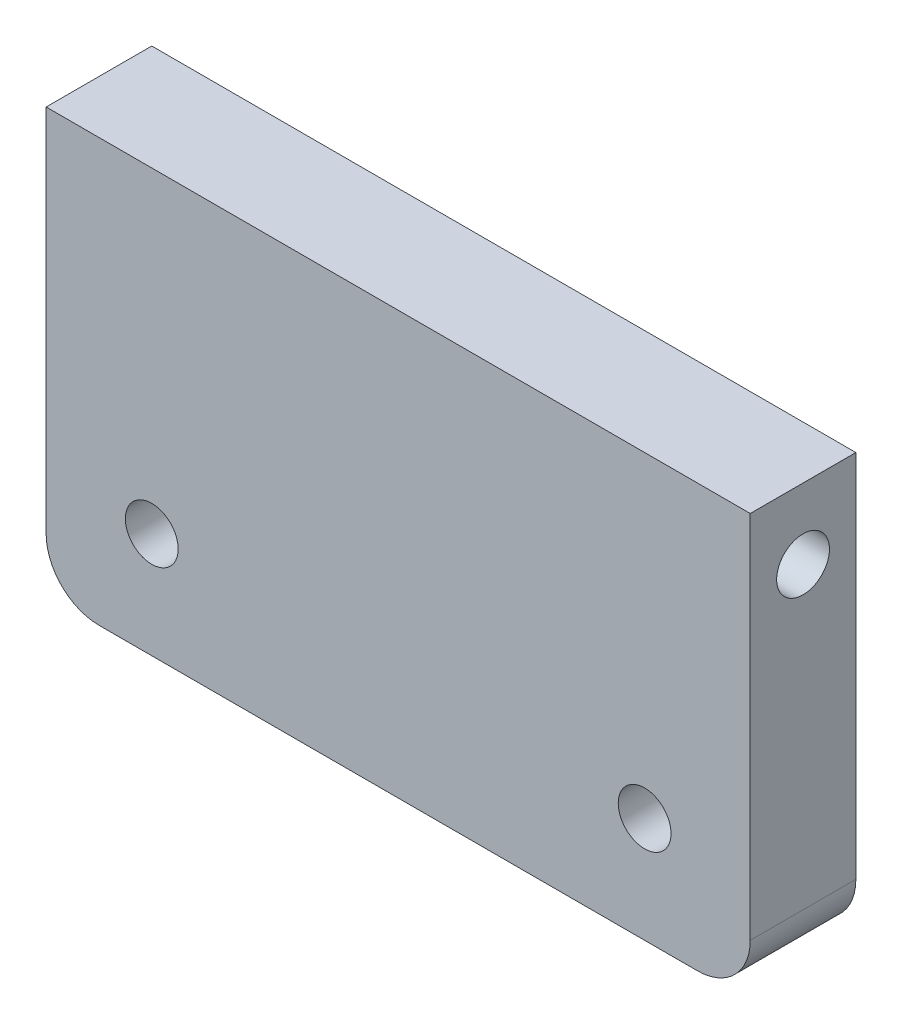
ISO-10303-21;
HEADER;
FILE_DESCRIPTION(('STEP AP214'),'2;1');
FILE_NAME('part.step','',(''),(''),'','','');
FILE_SCHEMA(('AUTOMOTIVE_DESIGN { 1 0 10303 214 1 1 1 1 }'));
ENDSEC;
DATA;
#1=APPLICATION_CONTEXT('core data for automotive mechanical design processes');
#2=APPLICATION_PROTOCOL_DEFINITION('international standard','automotive_design',2000,#1);
#3=PRODUCT_CONTEXT('',#1,'mechanical');
#4=PRODUCT('Part','Part','',(#3));
#5=PRODUCT_RELATED_PRODUCT_CATEGORY('part','',(#4));
#6=PRODUCT_DEFINITION_FORMATION('','',#4);
#7=PRODUCT_DEFINITION_CONTEXT('part definition',#1,'design');
#8=PRODUCT_DEFINITION('design','',#6,#7);
#9=PRODUCT_DEFINITION_SHAPE('','',#8);
#10=(LENGTH_UNIT() NAMED_UNIT(*) SI_UNIT(.MILLI.,.METRE.));
#11=(NAMED_UNIT(*) PLANE_ANGLE_UNIT() SI_UNIT($,.RADIAN.));
#12=(NAMED_UNIT(*) SI_UNIT($,.STERADIAN.) SOLID_ANGLE_UNIT());
#13=UNCERTAINTY_MEASURE_WITH_UNIT(LENGTH_MEASURE(1.E-05),#10,'distance_accuracy_value','');
#14=(GEOMETRIC_REPRESENTATION_CONTEXT(3) GLOBAL_UNCERTAINTY_ASSIGNED_CONTEXT((#13)) GLOBAL_UNIT_ASSIGNED_CONTEXT((#10,
#11,#12)) REPRESENTATION_CONTEXT('',''));
#15=CARTESIAN_POINT('',(0.,0.,0.));
#16=DIRECTION('',(0.,0.,1.));
#17=DIRECTION('',(1.,0.,0.));
#18=AXIS2_PLACEMENT_3D('',#15,#16,#17);
#19=CARTESIAN_POINT('',(-53.975,-28.575,19.05));
#20=DIRECTION('',(0.,0.,1.));
#21=DIRECTION('',(1.,0.,0.));
#22=AXIS2_PLACEMENT_3D('',#19,#20,#21);
#23=PLANE('',#22);
#24=CARTESIAN_POINT('',(-44.45,-19.05,19.05));
#25=DIRECTION('',(0.,0.,1.));
#26=DIRECTION('',(1.,0.,0.));
#27=AXIS2_PLACEMENT_3D('',#24,#25,#26);
#28=CIRCLE('',#27,4.7625);
#29=CARTESIAN_POINT('',(-49.2125,-19.05,19.05));
#30=VERTEX_POINT('',#29);
#31=EDGE_CURVE('E134',#30,#30,#28,.T.);
#32=ORIENTED_EDGE('',*,*,#31,.F.);
#33=EDGE_LOOP('',(#32));
#34=FACE_BOUND('',#33,.T.);
#35=DIRECTION('',(0.,-1.,0.));
#36=VECTOR('',#35,1.);
#37=CARTESIAN_POINT('',(-63.5,38.1,19.05));
#38=LINE('',#37,#36);
#39=CARTESIAN_POINT('',(-63.5,38.1,19.05));
#40=VERTEX_POINT('',#39);
#41=CARTESIAN_POINT('',(-63.5,-28.5749999999999,19.05));
#42=VERTEX_POINT('',#41);
#43=EDGE_CURVE('E146',#40,#42,#38,.T.);
#44=ORIENTED_EDGE('',*,*,#43,.T.);
#45=CARTESIAN_POINT('',(-53.975,-28.575,19.05));
#46=DIRECTION('',(0.,0.,1.));
#47=DIRECTION('',(1.,0.,0.));
#48=AXIS2_PLACEMENT_3D('',#45,#46,#47);
#49=CIRCLE('',#48,9.525);
#50=CARTESIAN_POINT('',(-53.9749999999999,-38.1,19.05));
#51=VERTEX_POINT('',#50);
#52=EDGE_CURVE('E94',#42,#51,#49,.T.);
#53=ORIENTED_EDGE('',*,*,#52,.T.);
#54=DIRECTION('',(1.,0.,0.));
#55=VECTOR('',#54,1.);
#56=CARTESIAN_POINT('',(-53.9749999999999,-38.1,19.05));
#57=LINE('',#56,#55);
#58=CARTESIAN_POINT('',(53.9749999999999,-38.1,19.05));
#59=VERTEX_POINT('',#58);
#60=EDGE_CURVE('E107',#51,#59,#57,.T.);
#61=ORIENTED_EDGE('',*,*,#60,.T.);
#62=CARTESIAN_POINT('',(53.975,-28.575,19.05));
#63=DIRECTION('',(0.,0.,1.));
#64=DIRECTION('',(-1.,0.,0.));
#65=AXIS2_PLACEMENT_3D('',#62,#63,#64);
#66=CIRCLE('',#65,9.525);
#67=CARTESIAN_POINT('',(63.5,-28.5749999999999,19.05));
#68=VERTEX_POINT('',#67);
#69=EDGE_CURVE('E101',#59,#68,#66,.T.);
#70=ORIENTED_EDGE('',*,*,#69,.T.);
#71=DIRECTION('',(0.,1.,0.));
#72=VECTOR('',#71,1.);
#73=CARTESIAN_POINT('',(63.5,38.1,19.05));
#74=LINE('',#73,#72);
#75=CARTESIAN_POINT('',(63.5,38.1,19.05));
#76=VERTEX_POINT('',#75);
#77=EDGE_CURVE('E105',#68,#76,#74,.T.);
#78=ORIENTED_EDGE('',*,*,#77,.T.);
#79=DIRECTION('',(-1.,0.,0.));
#80=VECTOR('',#79,1.);
#81=CARTESIAN_POINT('',(-63.5,38.1,19.05));
#82=LINE('',#81,#80);
#83=EDGE_CURVE('E57',#76,#40,#82,.T.);
#84=ORIENTED_EDGE('',*,*,#83,.T.);
#85=EDGE_LOOP('',(#44,#53,#61,#70,#78,#84));
#86=FACE_BOUND('',#85,.T.);
#87=CARTESIAN_POINT('',(44.45,-19.05,19.05));
#88=DIRECTION('',(0.,0.,1.));
#89=DIRECTION('',(-1.,0.,0.));
#90=AXIS2_PLACEMENT_3D('',#87,#88,#89);
#91=CIRCLE('',#90,4.7625);
#92=CARTESIAN_POINT('',(39.6875,-19.05,19.05));
#93=VERTEX_POINT('',#92);
#94=EDGE_CURVE('E208',#93,#93,#91,.T.);
#95=ORIENTED_EDGE('',*,*,#94,.F.);
#96=EDGE_LOOP('',(#95));
#97=FACE_BOUND('',#96,.T.);
#98=ADVANCED_FACE('F39',(#34,#86,#97),#23,.T.);
#99=CARTESIAN_POINT('',(-53.975,-28.575,0.));
#100=DIRECTION('',(0.,0.,1.));
#101=DIRECTION('',(1.,0.,0.));
#102=AXIS2_PLACEMENT_3D('',#99,#100,#101);
#103=PLANE('',#102);
#104=DIRECTION('',(0.,-1.,0.));
#105=VECTOR('',#104,1.);
#106=CARTESIAN_POINT('',(-63.5,38.1,0.));
#107=LINE('',#106,#105);
#108=CARTESIAN_POINT('',(-63.5,38.1,0.));
#109=VERTEX_POINT('',#108);
#110=CARTESIAN_POINT('',(-63.5,-28.5749999999999,0.));
#111=VERTEX_POINT('',#110);
#112=EDGE_CURVE('E129',#109,#111,#107,.T.);
#113=ORIENTED_EDGE('',*,*,#112,.F.);
#114=DIRECTION('',(-1.,0.,0.));
#115=VECTOR('',#114,1.);
#116=CARTESIAN_POINT('',(-63.5,38.1,0.));
#117=LINE('',#116,#115);
#118=CARTESIAN_POINT('',(63.5,38.1,0.));
#119=VERTEX_POINT('',#118);
#120=EDGE_CURVE('E86',#119,#109,#117,.T.);
#121=ORIENTED_EDGE('',*,*,#120,.F.);
#122=DIRECTION('',(0.,1.,0.));
#123=VECTOR('',#122,1.);
#124=CARTESIAN_POINT('',(63.5,38.1,0.));
#125=LINE('',#124,#123);
#126=CARTESIAN_POINT('',(63.5,-28.5749999999999,0.));
#127=VERTEX_POINT('',#126);
#128=EDGE_CURVE('E80',#127,#119,#125,.T.);
#129=ORIENTED_EDGE('',*,*,#128,.F.);
#130=CARTESIAN_POINT('',(53.975,-28.575,0.));
#131=DIRECTION('',(0.,0.,1.));
#132=DIRECTION('',(-1.,0.,0.));
#133=AXIS2_PLACEMENT_3D('',#130,#131,#132);
#134=CIRCLE('',#133,9.525);
#135=CARTESIAN_POINT('',(53.9749999999999,-38.1,0.));
#136=VERTEX_POINT('',#135);
#137=EDGE_CURVE('E116',#136,#127,#134,.T.);
#138=ORIENTED_EDGE('',*,*,#137,.F.);
#139=DIRECTION('',(1.,0.,0.));
#140=VECTOR('',#139,1.);
#141=CARTESIAN_POINT('',(-53.9749999999999,-38.1,0.));
#142=LINE('',#141,#140);
#143=CARTESIAN_POINT('',(-53.9749999999999,-38.1,0.));
#144=VERTEX_POINT('',#143);
#145=EDGE_CURVE('E137',#144,#136,#142,.T.);
#146=ORIENTED_EDGE('',*,*,#145,.F.);
#147=CARTESIAN_POINT('',(-53.975,-28.575,0.));
#148=DIRECTION('',(0.,0.,1.));
#149=DIRECTION('',(1.,0.,0.));
#150=AXIS2_PLACEMENT_3D('',#147,#148,#149);
#151=CIRCLE('',#150,9.525);
#152=EDGE_CURVE('E133',#111,#144,#151,.T.);
#153=ORIENTED_EDGE('',*,*,#152,.F.);
#154=EDGE_LOOP('',(#113,#121,#129,#138,#146,#153));
#155=FACE_BOUND('',#154,.T.);
#156=CARTESIAN_POINT('',(-44.45,-19.05,0.));
#157=DIRECTION('',(0.,0.,1.));
#158=DIRECTION('',(1.,0.,0.));
#159=AXIS2_PLACEMENT_3D('',#156,#157,#158);
#160=CIRCLE('',#159,4.7625);
#161=CARTESIAN_POINT('',(-49.2125,-19.05,0.));
#162=VERTEX_POINT('',#161);
#163=EDGE_CURVE('E214',#162,#162,#160,.T.);
#164=ORIENTED_EDGE('',*,*,#163,.T.);
#165=EDGE_LOOP('',(#164));
#166=FACE_BOUND('',#165,.T.);
#167=CARTESIAN_POINT('',(44.45,-19.05,0.));
#168=DIRECTION('',(0.,0.,1.));
#169=DIRECTION('',(-1.,0.,0.));
#170=AXIS2_PLACEMENT_3D('',#167,#168,#169);
#171=CIRCLE('',#170,4.7625);
#172=CARTESIAN_POINT('',(39.6875,-19.05,0.));
#173=VERTEX_POINT('',#172);
#174=EDGE_CURVE('E203',#173,#173,#171,.T.);
#175=ORIENTED_EDGE('',*,*,#174,.T.);
#176=EDGE_LOOP('',(#175));
#177=FACE_BOUND('',#176,.T.);
#178=ADVANCED_FACE('F159',(#155,#166,#177),#103,.F.);
#179=CARTESIAN_POINT('',(-63.5,38.1,19.05));
#180=DIRECTION('',(1.,0.,0.));
#181=DIRECTION('',(0.,0.,-1.));
#182=AXIS2_PLACEMENT_3D('',#179,#180,#181);
#183=PLANE('',#182);
#184=CARTESIAN_POINT('',(-63.5,25.4,9.525));
#185=DIRECTION('',(1.,0.,0.));
#186=DIRECTION('',(0.,0.,-1.));
#187=AXIS2_PLACEMENT_3D('',#184,#185,#186);
#188=CIRCLE('',#187,4.7625);
#189=CARTESIAN_POINT('',(-63.5,25.4,4.7625));
#190=VERTEX_POINT('',#189);
#191=EDGE_CURVE('E200',#190,#190,#188,.T.);
#192=ORIENTED_EDGE('',*,*,#191,.T.);
#193=EDGE_LOOP('',(#192));
#194=FACE_BOUND('',#193,.T.);
#195=ORIENTED_EDGE('',*,*,#112,.T.);
#196=DIRECTION('',(0.,0.,-1.));
#197=VECTOR('',#196,1.);
#198=CARTESIAN_POINT('',(-63.5,-28.5749999999999,19.05));
#199=LINE('',#198,#197);
#200=EDGE_CURVE('E11',#42,#111,#199,.T.);
#201=ORIENTED_EDGE('',*,*,#200,.F.);
#202=ORIENTED_EDGE('',*,*,#43,.F.);
#203=DIRECTION('',(0.,0.,-1.));
#204=VECTOR('',#203,1.);
#205=CARTESIAN_POINT('',(-63.5,38.1,19.05));
#206=LINE('',#205,#204);
#207=EDGE_CURVE('E125',#40,#109,#206,.T.);
#208=ORIENTED_EDGE('',*,*,#207,.T.);
#209=EDGE_LOOP('',(#195,#201,#202,#208));
#210=FACE_BOUND('',#209,.T.);
#211=ADVANCED_FACE('F41',(#194,#210),#183,.F.);
#212=CARTESIAN_POINT('',(-53.975,-28.575,19.05));
#213=DIRECTION('',(0.,0.,-1.));
#214=DIRECTION('',(-1.,0.,0.));
#215=AXIS2_PLACEMENT_3D('',#212,#213,#214);
#216=CYLINDRICAL_SURFACE('',#215,9.525);
#217=ORIENTED_EDGE('',*,*,#152,.T.);
#218=DIRECTION('',(0.,0.,-1.));
#219=VECTOR('',#218,1.);
#220=CARTESIAN_POINT('',(-53.9749999999999,-38.1,19.05));
#221=LINE('',#220,#219);
#222=EDGE_CURVE('E49',#51,#144,#221,.T.);
#223=ORIENTED_EDGE('',*,*,#222,.F.);
#224=ORIENTED_EDGE('',*,*,#52,.F.);
#225=ORIENTED_EDGE('',*,*,#200,.T.);
#226=EDGE_LOOP('',(#217,#223,#224,#225));
#227=FACE_BOUND('',#226,.T.);
#228=ADVANCED_FACE('F233',(#227),#216,.T.);
#229=CARTESIAN_POINT('',(-53.9749999999999,-38.1,19.05));
#230=DIRECTION('',(0.,1.,0.));
#231=DIRECTION('',(0.,0.,1.));
#232=AXIS2_PLACEMENT_3D('',#229,#230,#231);
#233=PLANE('',#232);
#234=ORIENTED_EDGE('',*,*,#145,.T.);
#235=DIRECTION('',(0.,0.,-1.));
#236=VECTOR('',#235,1.);
#237=CARTESIAN_POINT('',(53.9749999999999,-38.1,19.05));
#238=LINE('',#237,#236);
#239=EDGE_CURVE('E118',#59,#136,#238,.T.);
#240=ORIENTED_EDGE('',*,*,#239,.F.);
#241=ORIENTED_EDGE('',*,*,#60,.F.);
#242=ORIENTED_EDGE('',*,*,#222,.T.);
#243=EDGE_LOOP('',(#234,#240,#241,#242));
#244=FACE_BOUND('',#243,.T.);
#245=ADVANCED_FACE('F156',(#244),#233,.F.);
#246=CARTESIAN_POINT('',(53.975,-28.575,19.05));
#247=DIRECTION('',(0.,0.,-1.));
#248=DIRECTION('',(-1.,0.,0.));
#249=AXIS2_PLACEMENT_3D('',#246,#247,#248);
#250=CYLINDRICAL_SURFACE('',#249,9.525);
#251=ORIENTED_EDGE('',*,*,#137,.T.);
#252=DIRECTION('',(0.,0.,-1.));
#253=VECTOR('',#252,1.);
#254=CARTESIAN_POINT('',(63.5,-28.5749999999999,19.05));
#255=LINE('',#254,#253);
#256=EDGE_CURVE('E113',#68,#127,#255,.T.);
#257=ORIENTED_EDGE('',*,*,#256,.F.);
#258=ORIENTED_EDGE('',*,*,#69,.F.);
#259=ORIENTED_EDGE('',*,*,#239,.T.);
#260=EDGE_LOOP('',(#251,#257,#258,#259));
#261=FACE_BOUND('',#260,.T.);
#262=ADVANCED_FACE('F114',(#261),#250,.T.);
#263=CARTESIAN_POINT('',(63.5,38.1,19.05));
#264=DIRECTION('',(-1.,0.,0.));
#265=DIRECTION('',(0.,0.,1.));
#266=AXIS2_PLACEMENT_3D('',#263,#264,#265);
#267=PLANE('',#266);
#268=CARTESIAN_POINT('',(63.5,25.4,9.525));
#269=DIRECTION('',(1.,0.,0.));
#270=DIRECTION('',(0.,0.,-1.));
#271=AXIS2_PLACEMENT_3D('',#268,#269,#270);
#272=CIRCLE('',#271,4.7625);
#273=CARTESIAN_POINT('',(63.5,25.4,4.7625));
#274=VERTEX_POINT('',#273);
#275=EDGE_CURVE('E197',#274,#274,#272,.T.);
#276=ORIENTED_EDGE('',*,*,#275,.F.);
#277=EDGE_LOOP('',(#276));
#278=FACE_BOUND('',#277,.T.);
#279=ORIENTED_EDGE('',*,*,#128,.T.);
#280=DIRECTION('',(0.,0.,-1.));
#281=VECTOR('',#280,1.);
#282=CARTESIAN_POINT('',(63.5,38.1,19.05));
#283=LINE('',#282,#281);
#284=EDGE_CURVE('E119',#76,#119,#283,.T.);
#285=ORIENTED_EDGE('',*,*,#284,.F.);
#286=ORIENTED_EDGE('',*,*,#77,.F.);
#287=ORIENTED_EDGE('',*,*,#256,.T.);
#288=EDGE_LOOP('',(#279,#285,#286,#287));
#289=FACE_BOUND('',#288,.T.);
#290=ADVANCED_FACE('F121',(#278,#289),#267,.F.);
#291=CARTESIAN_POINT('',(-63.5,38.1,19.05));
#292=DIRECTION('',(0.,-1.,0.));
#293=DIRECTION('',(0.,0.,-1.));
#294=AXIS2_PLACEMENT_3D('',#291,#292,#293);
#295=PLANE('',#294);
#296=ORIENTED_EDGE('',*,*,#120,.T.);
#297=ORIENTED_EDGE('',*,*,#207,.F.);
#298=ORIENTED_EDGE('',*,*,#83,.F.);
#299=ORIENTED_EDGE('',*,*,#284,.T.);
#300=EDGE_LOOP('',(#296,#297,#298,#299));
#301=FACE_BOUND('',#300,.T.);
#302=ADVANCED_FACE('F164',(#301),#295,.F.);
#303=CARTESIAN_POINT('',(-44.45,-19.05,19.05));
#304=DIRECTION('',(0.,0.,-1.));
#305=DIRECTION('',(-1.,0.,0.));
#306=AXIS2_PLACEMENT_3D('',#303,#304,#305);
#307=CYLINDRICAL_SURFACE('',#306,4.7625);
#308=CARTESIAN_POINT('',(-49.2125,-19.05,19.05));
#309=CARTESIAN_POINT('',(-49.2125,-19.05,18.8515625));
#310=CARTESIAN_POINT('',(-49.2125,-19.05,18.653125));
#311=CARTESIAN_POINT('',(-49.2125,-19.05,18.25625));
#312=CARTESIAN_POINT('',(-49.2125,-19.05,18.0578125));
#313=CARTESIAN_POINT('',(-49.2125,-19.05,17.6609375));
#314=CARTESIAN_POINT('',(-49.2125,-19.05,17.4625));
#315=CARTESIAN_POINT('',(-49.2125,-19.05,17.065625));
#316=CARTESIAN_POINT('',(-49.2125,-19.05,16.8671875));
#317=CARTESIAN_POINT('',(-49.2125,-19.05,16.4703125));
#318=CARTESIAN_POINT('',(-49.2125,-19.05,16.271875));
#319=CARTESIAN_POINT('',(-49.2125,-19.05,15.875));
#320=CARTESIAN_POINT('',(-49.2125,-19.05,15.6765625));
#321=CARTESIAN_POINT('',(-49.2125,-19.05,15.2796875));
#322=CARTESIAN_POINT('',(-49.2125,-19.05,15.08125));
#323=CARTESIAN_POINT('',(-49.2125,-19.05,14.684375));
#324=CARTESIAN_POINT('',(-49.2125,-19.05,14.4859375));
#325=CARTESIAN_POINT('',(-49.2125,-19.05,14.0890625));
#326=CARTESIAN_POINT('',(-49.2125,-19.05,13.890625));
#327=CARTESIAN_POINT('',(-49.2125,-19.05,13.49375));
#328=CARTESIAN_POINT('',(-49.2125,-19.05,13.2953125));
#329=CARTESIAN_POINT('',(-49.2125,-19.05,12.8984375));
#330=CARTESIAN_POINT('',(-49.2125,-19.05,12.7));
#331=CARTESIAN_POINT('',(-49.2125,-19.05,12.303125));
#332=CARTESIAN_POINT('',(-49.2125,-19.05,12.1046875));
#333=CARTESIAN_POINT('',(-49.2125,-19.05,11.7078125));
#334=CARTESIAN_POINT('',(-49.2125,-19.05,11.509375));
#335=CARTESIAN_POINT('',(-49.2125,-19.05,11.1125));
#336=CARTESIAN_POINT('',(-49.2125,-19.05,10.9140625));
#337=CARTESIAN_POINT('',(-49.2125,-19.05,10.5171875));
#338=CARTESIAN_POINT('',(-49.2125,-19.05,10.31875));
#339=CARTESIAN_POINT('',(-49.2125,-19.05,9.921875));
#340=CARTESIAN_POINT('',(-49.2125,-19.05,9.7234375));
#341=CARTESIAN_POINT('',(-49.2125,-19.05,9.3265625));
#342=CARTESIAN_POINT('',(-49.2125,-19.05,9.128125));
#343=CARTESIAN_POINT('',(-49.2125,-19.05,8.73125));
#344=CARTESIAN_POINT('',(-49.2125,-19.05,8.5328125));
#345=CARTESIAN_POINT('',(-49.2125,-19.05,8.1359375));
#346=CARTESIAN_POINT('',(-49.2125,-19.05,7.9375));
#347=CARTESIAN_POINT('',(-49.2125,-19.05,7.540625));
#348=CARTESIAN_POINT('',(-49.2125,-19.05,7.3421875));
#349=CARTESIAN_POINT('',(-49.2125,-19.05,6.9453125));
#350=CARTESIAN_POINT('',(-49.2125,-19.05,6.746875));
#351=CARTESIAN_POINT('',(-49.2125,-19.05,6.35));
#352=CARTESIAN_POINT('',(-49.2125,-19.05,6.1515625));
#353=CARTESIAN_POINT('',(-49.2125,-19.05,5.7546875));
#354=CARTESIAN_POINT('',(-49.2125,-19.05,5.55625));
#355=CARTESIAN_POINT('',(-49.2125,-19.05,5.159375));
#356=CARTESIAN_POINT('',(-49.2125,-19.05,4.9609375));
#357=CARTESIAN_POINT('',(-49.2125,-19.05,4.5640625));
#358=CARTESIAN_POINT('',(-49.2125,-19.05,4.365625));
#359=CARTESIAN_POINT('',(-49.2125,-19.05,3.96875));
#360=CARTESIAN_POINT('',(-49.2125,-19.05,3.7703125));
#361=CARTESIAN_POINT('',(-49.2125,-19.05,3.3734375));
#362=CARTESIAN_POINT('',(-49.2125,-19.05,3.175));
#363=CARTESIAN_POINT('',(-49.2125,-19.05,2.778125));
#364=CARTESIAN_POINT('',(-49.2125,-19.05,2.5796875));
#365=CARTESIAN_POINT('',(-49.2125,-19.05,2.1828125));
#366=CARTESIAN_POINT('',(-49.2125,-19.05,1.984375));
#367=CARTESIAN_POINT('',(-49.2125,-19.05,1.5875));
#368=CARTESIAN_POINT('',(-49.2125,-19.05,1.3890625));
#369=CARTESIAN_POINT('',(-49.2125,-19.05,0.992187500000001));
#370=CARTESIAN_POINT('',(-49.2125,-19.05,0.793750000000001));
#371=CARTESIAN_POINT('',(-49.2125,-19.05,0.396875));
#372=CARTESIAN_POINT('',(-49.2125,-19.05,0.1984375));
#373=CARTESIAN_POINT('',(-49.2125,-19.05,0.));
#374=B_SPLINE_CURVE_WITH_KNOTS('',3,(#308,#309,#310,#311,#312,#313,#314,#315,#316,#317,#318,
#319,#320,#321,#322,#323,#324,#325,#326,#327,#328,#329,#330,#331,#332,#333,#334,#335,#336,#337,
#338,#339,#340,#341,#342,#343,#344,#345,#346,#347,#348,#349,#350,#351,#352,#353,#354,#355,#356,
#357,#358,#359,#360,#361,#362,#363,#364,#365,#366,#367,#368,#369,#370,#371,#372,#373),
.UNSPECIFIED.,.F.,.F.,(4,2,2,2,2,2,2,2,2,2,2,2,2,2,2,2,2,2,2,2,2,2,2,2,2,2,2,2,2,2,2,2,4),(0.,
0.5953125,1.190625,1.7859375,2.38125,2.9765625,3.571875,4.1671875,4.7625,5.3578125,5.953125,
6.5484375,7.14375,7.7390625,8.334375,8.9296875,9.525,10.1203125,10.715625,11.3109375,11.90625,
12.5015625,13.096875,13.6921875,14.2875,14.8828125,15.478125,16.0734375,16.66875,17.2640625,
17.859375,18.4546875,19.05),.UNSPECIFIED.);
#375=EDGE_CURVE('BSEAM166',#30,#162,#374,.T.);
#376=ORIENTED_EDGE('',*,*,#31,.T.);
#377=ORIENTED_EDGE('',*,*,#163,.F.);
#378=ORIENTED_EDGE('',*,*,#375,.T.);
#379=ORIENTED_EDGE('',*,*,#375,.F.);
#380=EDGE_LOOP('',(#376,#378,#377,#379));
#381=FACE_BOUND('',#380,.T.);
#382=ADVANCED_FACE('F166',(#381),#307,.F.);
#383=CARTESIAN_POINT('',(44.45,-19.05,19.05));
#384=DIRECTION('',(0.,0.,-1.));
#385=DIRECTION('',(-1.,0.,0.));
#386=AXIS2_PLACEMENT_3D('',#383,#384,#385);
#387=CYLINDRICAL_SURFACE('',#386,4.7625);
#388=CARTESIAN_POINT('',(39.6875,-19.05,19.05));
#389=CARTESIAN_POINT('',(39.6875,-19.05,18.8515625));
#390=CARTESIAN_POINT('',(39.6875,-19.05,18.653125));
#391=CARTESIAN_POINT('',(39.6875,-19.05,18.25625));
#392=CARTESIAN_POINT('',(39.6875,-19.05,18.0578125));
#393=CARTESIAN_POINT('',(39.6875,-19.05,17.6609375));
#394=CARTESIAN_POINT('',(39.6875,-19.05,17.4625));
#395=CARTESIAN_POINT('',(39.6875,-19.05,17.065625));
#396=CARTESIAN_POINT('',(39.6875,-19.05,16.8671875));
#397=CARTESIAN_POINT('',(39.6875,-19.05,16.4703125));
#398=CARTESIAN_POINT('',(39.6875,-19.05,16.271875));
#399=CARTESIAN_POINT('',(39.6875,-19.05,15.875));
#400=CARTESIAN_POINT('',(39.6875,-19.05,15.6765625));
#401=CARTESIAN_POINT('',(39.6875,-19.05,15.2796875));
#402=CARTESIAN_POINT('',(39.6875,-19.05,15.08125));
#403=CARTESIAN_POINT('',(39.6875,-19.05,14.684375));
#404=CARTESIAN_POINT('',(39.6875,-19.05,14.4859375));
#405=CARTESIAN_POINT('',(39.6875,-19.05,14.0890625));
#406=CARTESIAN_POINT('',(39.6875,-19.05,13.890625));
#407=CARTESIAN_POINT('',(39.6875,-19.05,13.49375));
#408=CARTESIAN_POINT('',(39.6875,-19.05,13.2953125));
#409=CARTESIAN_POINT('',(39.6875,-19.05,12.8984375));
#410=CARTESIAN_POINT('',(39.6875,-19.05,12.7));
#411=CARTESIAN_POINT('',(39.6875,-19.05,12.303125));
#412=CARTESIAN_POINT('',(39.6875,-19.05,12.1046875));
#413=CARTESIAN_POINT('',(39.6875,-19.05,11.7078125));
#414=CARTESIAN_POINT('',(39.6875,-19.05,11.509375));
#415=CARTESIAN_POINT('',(39.6875,-19.05,11.1125));
#416=CARTESIAN_POINT('',(39.6875,-19.05,10.9140625));
#417=CARTESIAN_POINT('',(39.6875,-19.05,10.5171875));
#418=CARTESIAN_POINT('',(39.6875,-19.05,10.31875));
#419=CARTESIAN_POINT('',(39.6875,-19.05,9.921875));
#420=CARTESIAN_POINT('',(39.6875,-19.05,9.7234375));
#421=CARTESIAN_POINT('',(39.6875,-19.05,9.3265625));
#422=CARTESIAN_POINT('',(39.6875,-19.05,9.128125));
#423=CARTESIAN_POINT('',(39.6875,-19.05,8.73125));
#424=CARTESIAN_POINT('',(39.6875,-19.05,8.5328125));
#425=CARTESIAN_POINT('',(39.6875,-19.05,8.1359375));
#426=CARTESIAN_POINT('',(39.6875,-19.05,7.9375));
#427=CARTESIAN_POINT('',(39.6875,-19.05,7.540625));
#428=CARTESIAN_POINT('',(39.6875,-19.05,7.3421875));
#429=CARTESIAN_POINT('',(39.6875,-19.05,6.9453125));
#430=CARTESIAN_POINT('',(39.6875,-19.05,6.746875));
#431=CARTESIAN_POINT('',(39.6875,-19.05,6.35));
#432=CARTESIAN_POINT('',(39.6875,-19.05,6.1515625));
#433=CARTESIAN_POINT('',(39.6875,-19.05,5.7546875));
#434=CARTESIAN_POINT('',(39.6875,-19.05,5.55625));
#435=CARTESIAN_POINT('',(39.6875,-19.05,5.159375));
#436=CARTESIAN_POINT('',(39.6875,-19.05,4.9609375));
#437=CARTESIAN_POINT('',(39.6875,-19.05,4.5640625));
#438=CARTESIAN_POINT('',(39.6875,-19.05,4.365625));
#439=CARTESIAN_POINT('',(39.6875,-19.05,3.96875));
#440=CARTESIAN_POINT('',(39.6875,-19.05,3.7703125));
#441=CARTESIAN_POINT('',(39.6875,-19.05,3.3734375));
#442=CARTESIAN_POINT('',(39.6875,-19.05,3.175));
#443=CARTESIAN_POINT('',(39.6875,-19.05,2.778125));
#444=CARTESIAN_POINT('',(39.6875,-19.05,2.5796875));
#445=CARTESIAN_POINT('',(39.6875,-19.05,2.1828125));
#446=CARTESIAN_POINT('',(39.6875,-19.05,1.984375));
#447=CARTESIAN_POINT('',(39.6875,-19.05,1.5875));
#448=CARTESIAN_POINT('',(39.6875,-19.05,1.3890625));
#449=CARTESIAN_POINT('',(39.6875,-19.05,0.992187500000001));
#450=CARTESIAN_POINT('',(39.6875,-19.05,0.793750000000001));
#451=CARTESIAN_POINT('',(39.6875,-19.05,0.396875));
#452=CARTESIAN_POINT('',(39.6875,-19.05,0.1984375));
#453=CARTESIAN_POINT('',(39.6875,-19.05,0.));
#454=B_SPLINE_CURVE_WITH_KNOTS('',3,(#388,#389,#390,#391,#392,#393,#394,#395,#396,#397,#398,
#399,#400,#401,#402,#403,#404,#405,#406,#407,#408,#409,#410,#411,#412,#413,#414,#415,#416,#417,
#418,#419,#420,#421,#422,#423,#424,#425,#426,#427,#428,#429,#430,#431,#432,#433,#434,#435,#436,
#437,#438,#439,#440,#441,#442,#443,#444,#445,#446,#447,#448,#449,#450,#451,#452,#453),
.UNSPECIFIED.,.F.,.F.,(4,2,2,2,2,2,2,2,2,2,2,2,2,2,2,2,2,2,2,2,2,2,2,2,2,2,2,2,2,2,2,2,4),(0.,
0.5953125,1.190625,1.7859375,2.38125,2.9765625,3.571875,4.1671875,4.7625,5.3578125,5.953125,
6.5484375,7.14375,7.7390625,8.334375,8.9296875,9.525,10.1203125,10.715625,11.3109375,11.90625,
12.5015625,13.096875,13.6921875,14.2875,14.8828125,15.478125,16.0734375,16.66875,17.2640625,
17.859375,18.4546875,19.05),.UNSPECIFIED.);
#455=EDGE_CURVE('BSEAM172',#93,#173,#454,.T.);
#456=ORIENTED_EDGE('',*,*,#94,.T.);
#457=ORIENTED_EDGE('',*,*,#174,.F.);
#458=ORIENTED_EDGE('',*,*,#455,.T.);
#459=ORIENTED_EDGE('',*,*,#455,.F.);
#460=EDGE_LOOP('',(#456,#458,#457,#459));
#461=FACE_BOUND('',#460,.T.);
#462=ADVANCED_FACE('F172',(#461),#387,.F.);
#463=CARTESIAN_POINT('',(-76.2000000000001,25.4,9.525));
#464=DIRECTION('',(1.,0.,0.));
#465=DIRECTION('',(0.,0.,-1.));
#466=AXIS2_PLACEMENT_3D('',#463,#464,#465);
#467=CYLINDRICAL_SURFACE('',#466,4.7625);
#468=ORIENTED_EDGE('',*,*,#275,.T.);
#469=EDGE_LOOP('',(#468));
#470=FACE_BOUND('',#469,.T.);
#471=ORIENTED_EDGE('',*,*,#191,.F.);
#472=EDGE_LOOP('',(#471));
#473=FACE_BOUND('',#472,.T.);
#474=ADVANCED_FACE('F188',(#470,#473),#467,.F.);
#475=CLOSED_SHELL('',(#98,#178,#211,#228,#245,#262,#290,#302,#382,#462,#474));
#476=MANIFOLD_SOLID_BREP('B2',#475);
#477=ADVANCED_BREP_SHAPE_REPRESENTATION('',(#18,#476),#14);
#478=SHAPE_DEFINITION_REPRESENTATION(#9,#477);
ENDSEC;
END-ISO-10303-21;
